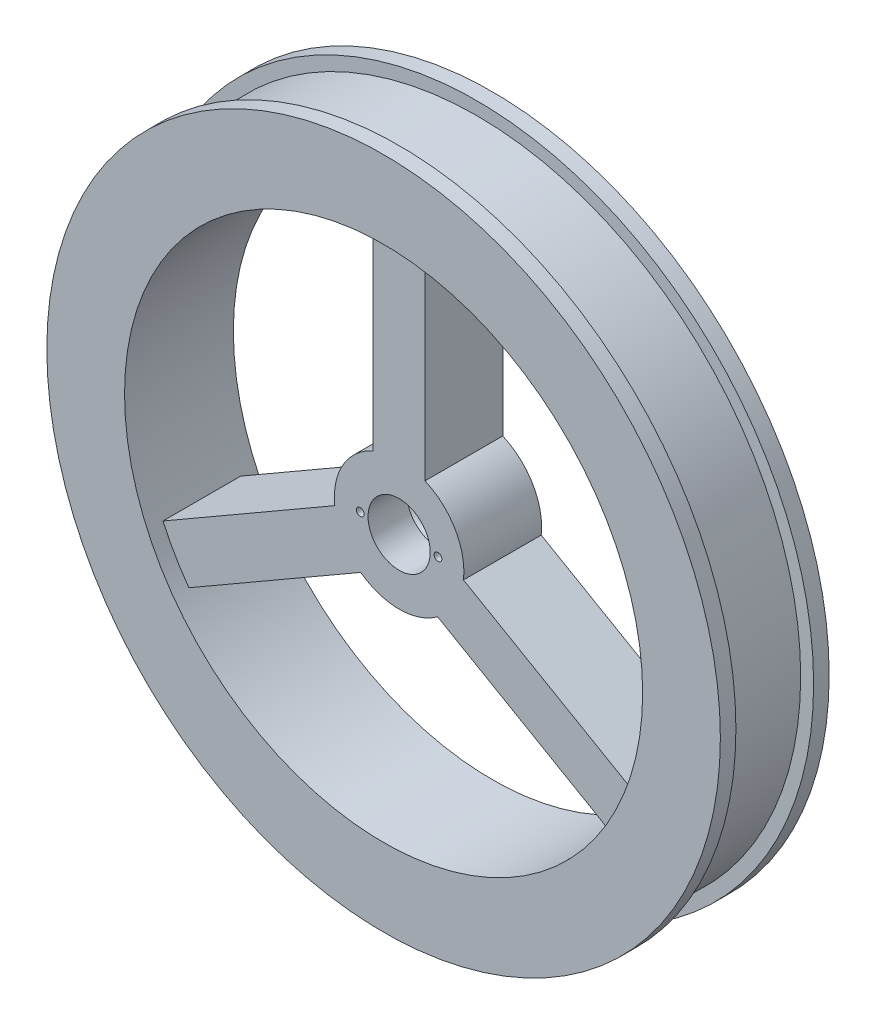
ISO-10303-21;
HEADER;
FILE_DESCRIPTION(('STEP AP214'),'2;1');
FILE_NAME('part.step','',(''),(''),'','','');
FILE_SCHEMA(('AUTOMOTIVE_DESIGN { 1 0 10303 214 1 1 1 1 }'));
ENDSEC;
DATA;
#1=APPLICATION_CONTEXT('core data for automotive mechanical design processes');
#2=APPLICATION_PROTOCOL_DEFINITION('international standard','automotive_design',2000,#1);
#3=PRODUCT_CONTEXT('',#1,'mechanical');
#4=PRODUCT('Part','Part','',(#3));
#5=PRODUCT_RELATED_PRODUCT_CATEGORY('part','',(#4));
#6=PRODUCT_DEFINITION_FORMATION('','',#4);
#7=PRODUCT_DEFINITION_CONTEXT('part definition',#1,'design');
#8=PRODUCT_DEFINITION('design','',#6,#7);
#9=PRODUCT_DEFINITION_SHAPE('','',#8);
#10=(LENGTH_UNIT() NAMED_UNIT(*) SI_UNIT(.MILLI.,.METRE.));
#11=(NAMED_UNIT(*) PLANE_ANGLE_UNIT() SI_UNIT($,.RADIAN.));
#12=(NAMED_UNIT(*) SI_UNIT($,.STERADIAN.) SOLID_ANGLE_UNIT());
#13=UNCERTAINTY_MEASURE_WITH_UNIT(LENGTH_MEASURE(1.E-05),#10,'distance_accuracy_value','');
#14=(GEOMETRIC_REPRESENTATION_CONTEXT(3) GLOBAL_UNCERTAINTY_ASSIGNED_CONTEXT((#13)) GLOBAL_UNIT_ASSIGNED_CONTEXT((#10,
#11,#12)) REPRESENTATION_CONTEXT('',''));
#15=CARTESIAN_POINT('',(0.,0.,0.));
#16=DIRECTION('',(0.,0.,1.));
#17=DIRECTION('',(1.,0.,0.));
#18=AXIS2_PLACEMENT_3D('',#15,#16,#17);
#19=CARTESIAN_POINT('',(0.,0.,150.));
#20=DIRECTION('',(0.,0.,-1.));
#21=DIRECTION('',(-1.,0.,0.));
#22=AXIS2_PLACEMENT_3D('',#19,#20,#21);
#23=CYLINDRICAL_SURFACE('',#22,60.);
#24=CARTESIAN_POINT('',(0.,0.,150.));
#25=DIRECTION('',(0.,0.,-1.));
#26=DIRECTION('',(-1.,0.,0.));
#27=AXIS2_PLACEMENT_3D('',#24,#25,#26);
#28=CIRCLE('',#27,60.);
#29=CARTESIAN_POINT('',(-60.,0.,150.));
#30=VERTEX_POINT('',#29);
#31=EDGE_CURVE('E275',#30,#30,#28,.T.);
#32=ORIENTED_EDGE('',*,*,#31,.F.);
#33=EDGE_LOOP('',(#32));
#34=FACE_BOUND('',#33,.T.);
#35=CARTESIAN_POINT('',(0.,0.,75.));
#36=DIRECTION('',(0.,0.,-1.));
#37=DIRECTION('',(-1.,0.,0.));
#38=AXIS2_PLACEMENT_3D('',#35,#36,#37);
#39=CIRCLE('',#38,60.);
#40=CARTESIAN_POINT('',(-60.,0.,75.));
#41=VERTEX_POINT('',#40);
#42=EDGE_CURVE('E188',#41,#41,#39,.F.);
#43=ORIENTED_EDGE('',*,*,#42,.F.);
#44=EDGE_LOOP('',(#43));
#45=FACE_BOUND('',#44,.T.);
#46=ADVANCED_FACE('F35',(#34,#45),#23,.F.);
#47=CARTESIAN_POINT('',(0.,0.,150.));
#48=DIRECTION('',(0.,0.,1.));
#49=DIRECTION('',(1.,0.,0.));
#50=AXIS2_PLACEMENT_3D('',#47,#48,#49);
#51=PLANE('',#50);
#52=CARTESIAN_POINT('',(0.,0.,150.));
#53=DIRECTION('',(0.,0.,-1.));
#54=DIRECTION('',(-1.,0.,0.));
#55=AXIS2_PLACEMENT_3D('',#52,#53,#54);
#56=CIRCLE('',#55,500.);
#57=CARTESIAN_POINT('',(-50.0000000000001,497.49371855331,150.));
#58=VERTEX_POINT('',#57);
#59=CARTESIAN_POINT('',(50.,497.49371855331,150.));
#60=VERTEX_POINT('',#59);
#61=EDGE_CURVE('E46',#58,#60,#56,.T.);
#62=ORIENTED_EDGE('',*,*,#61,.F.);
#63=DIRECTION('',(0.,1.,0.));
#64=VECTOR('',#63,1.);
#65=CARTESIAN_POINT('',(-50.0000000000001,497.49371855331,150.));
#66=LINE('',#65,#64);
#67=CARTESIAN_POINT('',(-50.,114.564392373896,150.));
#68=VERTEX_POINT('',#67);
#69=EDGE_CURVE('E130',#68,#58,#66,.T.);
#70=ORIENTED_EDGE('',*,*,#69,.F.);
#71=CARTESIAN_POINT('',(0.,0.,150.));
#72=DIRECTION('',(0.,0.,-1.));
#73=DIRECTION('',(1.,0.,0.));
#74=AXIS2_PLACEMENT_3D('',#71,#72,#73);
#75=CIRCLE('',#74,125.);
#76=CARTESIAN_POINT('',(-124.215674164922,-13.9809259977267,150.));
#77=VERTEX_POINT('',#76);
#78=EDGE_CURVE('E145',#77,#68,#75,.T.);
#79=ORIENTED_EDGE('',*,*,#78,.F.);
#80=DIRECTION('',(0.866025403784436,0.500000000000004,0.));
#81=VECTOR('',#80,1.);
#82=CARTESIAN_POINT('',(-124.215674164922,-13.9809259977267,150.));
#83=LINE('',#82,#81);
#84=CARTESIAN_POINT('',(-455.842198490351,-205.445589087435,150.));
#85=VERTEX_POINT('',#84);
#86=EDGE_CURVE('E304',#85,#77,#83,.T.);
#87=ORIENTED_EDGE('',*,*,#86,.F.);
#88=CARTESIAN_POINT('',(-405.842198490351,-292.048129465879,150.));
#89=VERTEX_POINT('',#88);
#90=EDGE_CURVE('E44',#89,#85,#56,.T.);
#91=ORIENTED_EDGE('',*,*,#90,.F.);
#92=DIRECTION('',(-0.866025403784436,-0.500000000000004,0.));
#93=VECTOR('',#92,1.);
#94=CARTESIAN_POINT('',(-74.2156741649217,-100.58346637617,150.));
#95=LINE('',#94,#93);
#96=CARTESIAN_POINT('',(-74.2156741649217,-100.58346637617,150.));
#97=VERTEX_POINT('',#96);
#98=EDGE_CURVE('E288',#97,#89,#95,.T.);
#99=ORIENTED_EDGE('',*,*,#98,.F.);
#100=CARTESIAN_POINT('',(0.,0.,150.));
#101=DIRECTION('',(0.,0.,-1.));
#102=DIRECTION('',(1.,0.,0.));
#103=AXIS2_PLACEMENT_3D('',#100,#101,#102);
#104=CIRCLE('',#103,125.);
#105=CARTESIAN_POINT('',(74.2156741649217,-100.58346637617,150.));
#106=VERTEX_POINT('',#105);
#107=EDGE_CURVE('E285',#106,#97,#104,.T.);
#108=ORIENTED_EDGE('',*,*,#107,.F.);
#109=DIRECTION('',(-0.866025403784436,0.500000000000004,0.));
#110=VECTOR('',#109,1.);
#111=CARTESIAN_POINT('',(74.2156741649217,-100.58346637617,150.));
#112=LINE('',#111,#110);
#113=CARTESIAN_POINT('',(405.842198490351,-292.048129465879,150.));
#114=VERTEX_POINT('',#113);
#115=EDGE_CURVE('E283',#114,#106,#112,.T.);
#116=ORIENTED_EDGE('',*,*,#115,.F.);
#117=CARTESIAN_POINT('',(455.842198490351,-205.445589087435,150.));
#118=VERTEX_POINT('',#117);
#119=EDGE_CURVE('E11',#118,#114,#56,.T.);
#120=ORIENTED_EDGE('',*,*,#119,.F.);
#121=DIRECTION('',(0.866025403784436,-0.500000000000004,0.));
#122=VECTOR('',#121,1.);
#123=CARTESIAN_POINT('',(124.215674164922,-13.9809259977266,150.));
#124=LINE('',#123,#122);
#125=CARTESIAN_POINT('',(124.215674164922,-13.9809259977266,150.));
#126=VERTEX_POINT('',#125);
#127=EDGE_CURVE('E167',#126,#118,#124,.T.);
#128=ORIENTED_EDGE('',*,*,#127,.F.);
#129=CARTESIAN_POINT('',(0.,0.,150.));
#130=DIRECTION('',(0.,0.,-1.));
#131=DIRECTION('',(1.,0.,0.));
#132=AXIS2_PLACEMENT_3D('',#129,#130,#131);
#133=CIRCLE('',#132,125.);
#134=CARTESIAN_POINT('',(50.,114.564392373896,150.));
#135=VERTEX_POINT('',#134);
#136=EDGE_CURVE('E163',#135,#126,#133,.T.);
#137=ORIENTED_EDGE('',*,*,#136,.F.);
#138=DIRECTION('',(0.,-1.,0.));
#139=VECTOR('',#138,1.);
#140=CARTESIAN_POINT('',(50.,497.49371855331,150.));
#141=LINE('',#140,#139);
#142=EDGE_CURVE('E132',#60,#135,#141,.T.);
#143=ORIENTED_EDGE('',*,*,#142,.F.);
#144=EDGE_LOOP('',(#62,#70,#79,#87,#91,#99,#108,#116,#120,#128,#137,#143));
#145=FACE_BOUND('',#144,.T.);
#146=CARTESIAN_POINT('',(75.,0.,150.));
#147=DIRECTION('',(0.,0.,-1.));
#148=DIRECTION('',(-1.,0.,0.));
#149=AXIS2_PLACEMENT_3D('',#146,#147,#148);
#150=CIRCLE('',#149,7.50000000000001);
#151=CARTESIAN_POINT('',(67.5,0.,150.));
#152=VERTEX_POINT('',#151);
#153=EDGE_CURVE('E331',#152,#152,#150,.T.);
#154=ORIENTED_EDGE('',*,*,#153,.T.);
#155=EDGE_LOOP('',(#154));
#156=FACE_BOUND('',#155,.T.);
#157=CARTESIAN_POINT('',(-75.,0.,150.));
#158=DIRECTION('',(0.,0.,-1.));
#159=DIRECTION('',(-1.,0.,0.));
#160=AXIS2_PLACEMENT_3D('',#157,#158,#159);
#161=CIRCLE('',#160,7.50000000000001);
#162=CARTESIAN_POINT('',(-82.5,0.,150.));
#163=VERTEX_POINT('',#162);
#164=EDGE_CURVE('E191',#163,#163,#161,.T.);
#165=ORIENTED_EDGE('',*,*,#164,.T.);
#166=EDGE_LOOP('',(#165));
#167=FACE_BOUND('',#166,.T.);
#168=ORIENTED_EDGE('',*,*,#31,.T.);
#169=EDGE_LOOP('',(#168));
#170=FACE_BOUND('',#169,.T.);
#171=ADVANCED_FACE('F127',(#145,#156,#167,#170),#51,.T.);
#172=CARTESIAN_POINT('',(0.,0.,0.));
#173=DIRECTION('',(0.,0.,1.));
#174=DIRECTION('',(1.,0.,0.));
#175=AXIS2_PLACEMENT_3D('',#172,#173,#174);
#176=PLANE('',#175);
#177=CARTESIAN_POINT('',(75.,0.,0.));
#178=DIRECTION('',(0.,0.,-1.));
#179=DIRECTION('',(-1.,0.,0.));
#180=AXIS2_PLACEMENT_3D('',#177,#178,#179);
#181=CIRCLE('',#180,7.50000000000001);
#182=CARTESIAN_POINT('',(67.5,0.,0.));
#183=VERTEX_POINT('',#182);
#184=EDGE_CURVE('E320',#183,#183,#181,.T.);
#185=ORIENTED_EDGE('',*,*,#184,.F.);
#186=EDGE_LOOP('',(#185));
#187=FACE_BOUND('',#186,.T.);
#188=CARTESIAN_POINT('',(-75.,0.,0.));
#189=DIRECTION('',(0.,0.,-1.));
#190=DIRECTION('',(-1.,0.,0.));
#191=AXIS2_PLACEMENT_3D('',#188,#189,#190);
#192=CIRCLE('',#191,7.50000000000001);
#193=CARTESIAN_POINT('',(-82.5,0.,0.));
#194=VERTEX_POINT('',#193);
#195=EDGE_CURVE('E323',#194,#194,#192,.T.);
#196=ORIENTED_EDGE('',*,*,#195,.F.);
#197=EDGE_LOOP('',(#196));
#198=FACE_BOUND('',#197,.T.);
#199=CARTESIAN_POINT('',(0.,0.,0.));
#200=DIRECTION('',(0.,0.,-1.));
#201=DIRECTION('',(-1.,0.,0.));
#202=AXIS2_PLACEMENT_3D('',#199,#200,#201);
#203=CIRCLE('',#202,60.);
#204=CARTESIAN_POINT('',(-60.,0.,0.));
#205=VERTEX_POINT('',#204);
#206=EDGE_CURVE('E273',#205,#205,#203,.T.);
#207=ORIENTED_EDGE('',*,*,#206,.F.);
#208=EDGE_LOOP('',(#207));
#209=FACE_BOUND('',#208,.T.);
#210=DIRECTION('',(0.,1.,0.));
#211=VECTOR('',#210,1.);
#212=CARTESIAN_POINT('',(-50.0000000000001,497.49371855331,0.));
#213=LINE('',#212,#211);
#214=CARTESIAN_POINT('',(-50.,114.564392373896,0.));
#215=VERTEX_POINT('',#214);
#216=CARTESIAN_POINT('',(-50.0000000000001,497.49371855331,0.));
#217=VERTEX_POINT('',#216);
#218=EDGE_CURVE('E155',#215,#217,#213,.T.);
#219=ORIENTED_EDGE('',*,*,#218,.T.);
#220=CARTESIAN_POINT('',(0.,0.,0.));
#221=DIRECTION('',(0.,0.,-1.));
#222=DIRECTION('',(-1.,0.,0.));
#223=AXIS2_PLACEMENT_3D('',#220,#221,#222);
#224=CIRCLE('',#223,500.);
#225=CARTESIAN_POINT('',(50.,497.49371855331,0.));
#226=VERTEX_POINT('',#225);
#227=EDGE_CURVE('E150',#217,#226,#224,.T.);
#228=ORIENTED_EDGE('',*,*,#227,.T.);
#229=DIRECTION('',(0.,-1.,0.));
#230=VECTOR('',#229,1.);
#231=CARTESIAN_POINT('',(50.,497.49371855331,0.));
#232=LINE('',#231,#230);
#233=CARTESIAN_POINT('',(50.,114.564392373896,0.));
#234=VERTEX_POINT('',#233);
#235=EDGE_CURVE('E161',#226,#234,#232,.T.);
#236=ORIENTED_EDGE('',*,*,#235,.T.);
#237=CARTESIAN_POINT('',(0.,0.,0.));
#238=DIRECTION('',(0.,0.,-1.));
#239=DIRECTION('',(1.,0.,0.));
#240=AXIS2_PLACEMENT_3D('',#237,#238,#239);
#241=CIRCLE('',#240,125.);
#242=CARTESIAN_POINT('',(124.215674164922,-13.9809259977266,0.));
#243=VERTEX_POINT('',#242);
#244=EDGE_CURVE('E173',#234,#243,#241,.T.);
#245=ORIENTED_EDGE('',*,*,#244,.T.);
#246=DIRECTION('',(0.866025403784436,-0.500000000000004,0.));
#247=VECTOR('',#246,1.);
#248=CARTESIAN_POINT('',(124.215674164922,-13.9809259977266,0.));
#249=LINE('',#248,#247);
#250=CARTESIAN_POINT('',(455.842198490351,-205.445589087435,0.));
#251=VERTEX_POINT('',#250);
#252=EDGE_CURVE('E164',#243,#251,#249,.T.);
#253=ORIENTED_EDGE('',*,*,#252,.T.);
#254=CARTESIAN_POINT('',(405.842198490351,-292.048129465879,0.));
#255=VERTEX_POINT('',#254);
#256=EDGE_CURVE('E201',#251,#255,#224,.T.);
#257=ORIENTED_EDGE('',*,*,#256,.T.);
#258=DIRECTION('',(-0.866025403784436,0.500000000000004,0.));
#259=VECTOR('',#258,1.);
#260=CARTESIAN_POINT('',(74.2156741649217,-100.58346637617,0.));
#261=LINE('',#260,#259);
#262=CARTESIAN_POINT('',(74.2156741649217,-100.58346637617,0.));
#263=VERTEX_POINT('',#262);
#264=EDGE_CURVE('E278',#255,#263,#261,.T.);
#265=ORIENTED_EDGE('',*,*,#264,.T.);
#266=CARTESIAN_POINT('',(0.,0.,0.));
#267=DIRECTION('',(0.,0.,-1.));
#268=DIRECTION('',(1.,0.,0.));
#269=AXIS2_PLACEMENT_3D('',#266,#267,#268);
#270=CIRCLE('',#269,125.);
#271=CARTESIAN_POINT('',(-74.2156741649217,-100.58346637617,0.));
#272=VERTEX_POINT('',#271);
#273=EDGE_CURVE('E292',#263,#272,#270,.T.);
#274=ORIENTED_EDGE('',*,*,#273,.T.);
#275=DIRECTION('',(-0.866025403784436,-0.500000000000004,0.));
#276=VECTOR('',#275,1.);
#277=CARTESIAN_POINT('',(-74.2156741649217,-100.58346637617,0.));
#278=LINE('',#277,#276);
#279=CARTESIAN_POINT('',(-405.842198490351,-292.048129465879,0.));
#280=VERTEX_POINT('',#279);
#281=EDGE_CURVE('E286',#272,#280,#278,.T.);
#282=ORIENTED_EDGE('',*,*,#281,.T.);
#283=CARTESIAN_POINT('',(-455.842198490351,-205.445589087435,0.));
#284=VERTEX_POINT('',#283);
#285=EDGE_CURVE('E197',#280,#284,#224,.T.);
#286=ORIENTED_EDGE('',*,*,#285,.T.);
#287=DIRECTION('',(0.866025403784436,0.500000000000004,0.));
#288=VECTOR('',#287,1.);
#289=CARTESIAN_POINT('',(-124.215674164922,-13.9809259977267,0.));
#290=LINE('',#289,#288);
#291=CARTESIAN_POINT('',(-124.215674164922,-13.9809259977267,0.));
#292=VERTEX_POINT('',#291);
#293=EDGE_CURVE('E303',#284,#292,#290,.T.);
#294=ORIENTED_EDGE('',*,*,#293,.T.);
#295=CARTESIAN_POINT('',(0.,0.,0.));
#296=DIRECTION('',(0.,0.,-1.));
#297=DIRECTION('',(1.,0.,0.));
#298=AXIS2_PLACEMENT_3D('',#295,#296,#297);
#299=CIRCLE('',#298,125.);
#300=EDGE_CURVE('E307',#292,#215,#299,.T.);
#301=ORIENTED_EDGE('',*,*,#300,.T.);
#302=EDGE_LOOP('',(#219,#228,#236,#245,#253,#257,#265,#274,#282,#286,#294,#301));
#303=FACE_BOUND('',#302,.T.);
#304=ADVANCED_FACE('F240',(#187,#198,#209,#303),#176,.F.);
#305=CARTESIAN_POINT('',(0.,0.,150.));
#306=DIRECTION('',(0.,0.,-1.));
#307=DIRECTION('',(-1.,0.,0.));
#308=AXIS2_PLACEMENT_3D('',#305,#306,#307);
#309=CYLINDRICAL_SURFACE('',#308,625.);
#310=CARTESIAN_POINT('',(0.,0.,150.));
#311=DIRECTION('',(0.,0.,1.));
#312=DIRECTION('',(1.,0.,0.));
#313=AXIS2_PLACEMENT_3D('',#310,#311,#312);
#314=CIRCLE('',#313,625.);
#315=CARTESIAN_POINT('',(625.,0.,150.));
#316=VERTEX_POINT('',#315);
#317=EDGE_CURVE('E185',#316,#316,#314,.T.);
#318=ORIENTED_EDGE('',*,*,#317,.F.);
#319=EDGE_LOOP('',(#318));
#320=FACE_BOUND('',#319,.T.);
#321=CARTESIAN_POINT('',(0.,0.,0.));
#322=DIRECTION('',(0.,0.,1.));
#323=DIRECTION('',(1.,0.,0.));
#324=AXIS2_PLACEMENT_3D('',#321,#322,#323);
#325=CIRCLE('',#324,625.);
#326=CARTESIAN_POINT('',(625.,0.,0.));
#327=VERTEX_POINT('',#326);
#328=EDGE_CURVE('E189',#327,#327,#325,.T.);
#329=ORIENTED_EDGE('',*,*,#328,.T.);
#330=EDGE_LOOP('',(#329));
#331=FACE_BOUND('',#330,.T.);
#332=ADVANCED_FACE('F229',(#320,#331),#309,.T.);
#333=CARTESIAN_POINT('',(0.,0.,150.));
#334=DIRECTION('',(0.,0.,-1.));
#335=DIRECTION('',(-1.,0.,0.));
#336=AXIS2_PLACEMENT_3D('',#333,#334,#335);
#337=CYLINDRICAL_SURFACE('',#336,500.);
#338=ORIENTED_EDGE('',*,*,#61,.T.);
#339=DIRECTION('',(0.,0.,-1.));
#340=VECTOR('',#339,1.);
#341=CARTESIAN_POINT('',(50.,497.49371855331,150.));
#342=LINE('',#341,#340);
#343=EDGE_CURVE('E183',#60,#226,#342,.T.);
#344=ORIENTED_EDGE('',*,*,#343,.T.);
#345=ORIENTED_EDGE('',*,*,#227,.F.);
#346=DIRECTION('',(0.,0.,-1.));
#347=VECTOR('',#346,1.);
#348=CARTESIAN_POINT('',(-50.0000000000001,497.49371855331,150.));
#349=LINE('',#348,#347);
#350=EDGE_CURVE('E141',#58,#217,#349,.T.);
#351=ORIENTED_EDGE('',*,*,#350,.F.);
#352=EDGE_LOOP('',(#338,#344,#345,#351));
#353=FACE_BOUND('',#352,.T.);
#354=ORIENTED_EDGE('',*,*,#119,.T.);
#355=DIRECTION('',(0.,0.,-1.));
#356=VECTOR('',#355,1.);
#357=CARTESIAN_POINT('',(405.842198490351,-292.048129465879,150.));
#358=LINE('',#357,#356);
#359=EDGE_CURVE('E300',#114,#255,#358,.T.);
#360=ORIENTED_EDGE('',*,*,#359,.T.);
#361=ORIENTED_EDGE('',*,*,#256,.F.);
#362=DIRECTION('',(0.,0.,-1.));
#363=VECTOR('',#362,1.);
#364=CARTESIAN_POINT('',(455.842198490351,-205.445589087435,150.));
#365=LINE('',#364,#363);
#366=EDGE_CURVE('E170',#118,#251,#365,.T.);
#367=ORIENTED_EDGE('',*,*,#366,.F.);
#368=EDGE_LOOP('',(#354,#360,#361,#367));
#369=FACE_BOUND('',#368,.T.);
#370=DIRECTION('',(0.,0.,-1.));
#371=VECTOR('',#370,1.);
#372=CARTESIAN_POINT('',(-405.842198490351,-292.048129465879,150.));
#373=LINE('',#372,#371);
#374=EDGE_CURVE('E58',#89,#280,#373,.T.);
#375=ORIENTED_EDGE('',*,*,#374,.F.);
#376=ORIENTED_EDGE('',*,*,#90,.T.);
#377=DIRECTION('',(0.,0.,-1.));
#378=VECTOR('',#377,1.);
#379=CARTESIAN_POINT('',(-455.842198490351,-205.445589087435,150.));
#380=LINE('',#379,#378);
#381=EDGE_CURVE('E159',#85,#284,#380,.T.);
#382=ORIENTED_EDGE('',*,*,#381,.T.);
#383=ORIENTED_EDGE('',*,*,#285,.F.);
#384=EDGE_LOOP('',(#375,#376,#382,#383));
#385=FACE_BOUND('',#384,.T.);
#386=CARTESIAN_POINT('',(0.,0.,-30.));
#387=DIRECTION('',(0.,0.,-1.));
#388=DIRECTION('',(-1.,0.,0.));
#389=AXIS2_PLACEMENT_3D('',#386,#387,#388);
#390=CIRCLE('',#389,500.);
#391=CARTESIAN_POINT('',(-500.,0.,-30.));
#392=VERTEX_POINT('',#391);
#393=EDGE_CURVE('E208',#392,#392,#390,.T.);
#394=ORIENTED_EDGE('',*,*,#393,.T.);
#395=EDGE_LOOP('',(#394));
#396=FACE_BOUND('',#395,.T.);
#397=CARTESIAN_POINT('',(0.,0.,180.));
#398=DIRECTION('',(0.,0.,-1.));
#399=DIRECTION('',(-1.,0.,0.));
#400=AXIS2_PLACEMENT_3D('',#397,#398,#399);
#401=CIRCLE('',#400,500.);
#402=CARTESIAN_POINT('',(-500.,0.,180.));
#403=VERTEX_POINT('',#402);
#404=EDGE_CURVE('E137',#403,#403,#401,.T.);
#405=ORIENTED_EDGE('',*,*,#404,.F.);
#406=EDGE_LOOP('',(#405));
#407=FACE_BOUND('',#406,.T.);
#408=ADVANCED_FACE('F148',(#353,#369,#385,#396,#407),#337,.F.);
#409=CARTESIAN_POINT('',(50.,497.49371855331,150.));
#410=DIRECTION('',(1.,0.,0.));
#411=DIRECTION('',(0.,1.,0.));
#412=AXIS2_PLACEMENT_3D('',#409,#410,#411);
#413=PLANE('',#412);
#414=ORIENTED_EDGE('',*,*,#235,.F.);
#415=ORIENTED_EDGE('',*,*,#343,.F.);
#416=ORIENTED_EDGE('',*,*,#142,.T.);
#417=DIRECTION('',(0.,0.,-1.));
#418=VECTOR('',#417,1.);
#419=CARTESIAN_POINT('',(50.,114.564392373896,150.));
#420=LINE('',#419,#418);
#421=EDGE_CURVE('E181',#135,#234,#420,.T.);
#422=ORIENTED_EDGE('',*,*,#421,.T.);
#423=EDGE_LOOP('',(#414,#415,#416,#422));
#424=FACE_BOUND('',#423,.T.);
#425=ADVANCED_FACE('F228',(#424),#413,.T.);
#426=CARTESIAN_POINT('',(0.,0.,150.));
#427=DIRECTION('',(0.,0.,-1.));
#428=DIRECTION('',(-1.,0.,0.));
#429=AXIS2_PLACEMENT_3D('',#426,#427,#428);
#430=CYLINDRICAL_SURFACE('',#429,125.);
#431=ORIENTED_EDGE('',*,*,#244,.F.);
#432=ORIENTED_EDGE('',*,*,#421,.F.);
#433=ORIENTED_EDGE('',*,*,#136,.T.);
#434=DIRECTION('',(0.,0.,-1.));
#435=VECTOR('',#434,1.);
#436=CARTESIAN_POINT('',(124.215674164922,-13.9809259977266,150.));
#437=LINE('',#436,#435);
#438=EDGE_CURVE('E179',#126,#243,#437,.T.);
#439=ORIENTED_EDGE('',*,*,#438,.T.);
#440=EDGE_LOOP('',(#431,#432,#433,#439));
#441=FACE_BOUND('',#440,.T.);
#442=ADVANCED_FACE('F236',(#441),#430,.T.);
#443=CARTESIAN_POINT('',(124.215674164922,-13.9809259977266,150.));
#444=DIRECTION('',(0.500000000000004,0.866025403784436,0.));
#445=DIRECTION('',(-0.866025403784436,0.500000000000004,0.));
#446=AXIS2_PLACEMENT_3D('',#443,#444,#445);
#447=PLANE('',#446);
#448=ORIENTED_EDGE('',*,*,#252,.F.);
#449=ORIENTED_EDGE('',*,*,#438,.F.);
#450=ORIENTED_EDGE('',*,*,#127,.T.);
#451=ORIENTED_EDGE('',*,*,#366,.T.);
#452=EDGE_LOOP('',(#448,#449,#450,#451));
#453=FACE_BOUND('',#452,.T.);
#454=ADVANCED_FACE('F491',(#453),#447,.T.);
#455=CARTESIAN_POINT('',(-124.215674164922,-13.9809259977267,150.));
#456=DIRECTION('',(-0.500000000000004,0.866025403784436,0.));
#457=DIRECTION('',(-0.866025403784436,-0.500000000000004,0.));
#458=AXIS2_PLACEMENT_3D('',#455,#456,#457);
#459=PLANE('',#458);
#460=ORIENTED_EDGE('',*,*,#293,.F.);
#461=ORIENTED_EDGE('',*,*,#381,.F.);
#462=ORIENTED_EDGE('',*,*,#86,.T.);
#463=DIRECTION('',(0.,0.,-1.));
#464=VECTOR('',#463,1.);
#465=CARTESIAN_POINT('',(-124.215674164922,-13.9809259977267,150.));
#466=LINE('',#465,#464);
#467=EDGE_CURVE('E152',#77,#292,#466,.T.);
#468=ORIENTED_EDGE('',*,*,#467,.T.);
#469=EDGE_LOOP('',(#460,#461,#462,#468));
#470=FACE_BOUND('',#469,.T.);
#471=ADVANCED_FACE('F495',(#470),#459,.T.);
#472=CARTESIAN_POINT('',(0.,0.,150.));
#473=DIRECTION('',(0.,0.,-1.));
#474=DIRECTION('',(-1.,0.,0.));
#475=AXIS2_PLACEMENT_3D('',#472,#473,#474);
#476=CYLINDRICAL_SURFACE('',#475,125.);
#477=ORIENTED_EDGE('',*,*,#300,.F.);
#478=ORIENTED_EDGE('',*,*,#467,.F.);
#479=ORIENTED_EDGE('',*,*,#78,.T.);
#480=DIRECTION('',(0.,0.,-1.));
#481=VECTOR('',#480,1.);
#482=CARTESIAN_POINT('',(-50.,114.564392373896,150.));
#483=LINE('',#482,#481);
#484=EDGE_CURVE('E143',#68,#215,#483,.T.);
#485=ORIENTED_EDGE('',*,*,#484,.T.);
#486=EDGE_LOOP('',(#477,#478,#479,#485));
#487=FACE_BOUND('',#486,.T.);
#488=ADVANCED_FACE('F503',(#487),#476,.T.);
#489=CARTESIAN_POINT('',(-50.0000000000001,497.49371855331,150.));
#490=DIRECTION('',(-1.,0.,0.));
#491=DIRECTION('',(0.,-1.,0.));
#492=AXIS2_PLACEMENT_3D('',#489,#490,#491);
#493=PLANE('',#492);
#494=ORIENTED_EDGE('',*,*,#218,.F.);
#495=ORIENTED_EDGE('',*,*,#484,.F.);
#496=ORIENTED_EDGE('',*,*,#69,.T.);
#497=ORIENTED_EDGE('',*,*,#350,.T.);
#498=EDGE_LOOP('',(#494,#495,#496,#497));
#499=FACE_BOUND('',#498,.T.);
#500=ADVANCED_FACE('F140',(#499),#493,.T.);
#501=CARTESIAN_POINT('',(74.2156741649217,-100.58346637617,150.));
#502=DIRECTION('',(-0.500000000000004,-0.866025403784436,0.));
#503=DIRECTION('',(0.866025403784436,-0.500000000000004,0.));
#504=AXIS2_PLACEMENT_3D('',#501,#502,#503);
#505=PLANE('',#504);
#506=ORIENTED_EDGE('',*,*,#264,.F.);
#507=ORIENTED_EDGE('',*,*,#359,.F.);
#508=ORIENTED_EDGE('',*,*,#115,.T.);
#509=DIRECTION('',(0.,0.,-1.));
#510=VECTOR('',#509,1.);
#511=CARTESIAN_POINT('',(74.2156741649217,-100.58346637617,150.));
#512=LINE('',#511,#510);
#513=EDGE_CURVE('E298',#106,#263,#512,.T.);
#514=ORIENTED_EDGE('',*,*,#513,.T.);
#515=EDGE_LOOP('',(#506,#507,#508,#514));
#516=FACE_BOUND('',#515,.T.);
#517=ADVANCED_FACE('F512',(#516),#505,.T.);
#518=CARTESIAN_POINT('',(0.,0.,150.));
#519=DIRECTION('',(0.,0.,-1.));
#520=DIRECTION('',(-1.,0.,0.));
#521=AXIS2_PLACEMENT_3D('',#518,#519,#520);
#522=CYLINDRICAL_SURFACE('',#521,125.);
#523=ORIENTED_EDGE('',*,*,#273,.F.);
#524=ORIENTED_EDGE('',*,*,#513,.F.);
#525=ORIENTED_EDGE('',*,*,#107,.T.);
#526=DIRECTION('',(0.,0.,-1.));
#527=VECTOR('',#526,1.);
#528=CARTESIAN_POINT('',(-74.2156741649217,-100.58346637617,150.));
#529=LINE('',#528,#527);
#530=EDGE_CURVE('E53',#97,#272,#529,.T.);
#531=ORIENTED_EDGE('',*,*,#530,.T.);
#532=EDGE_LOOP('',(#523,#524,#525,#531));
#533=FACE_BOUND('',#532,.T.);
#534=ADVANCED_FACE('F266',(#533),#522,.T.);
#535=CARTESIAN_POINT('',(-74.2156741649217,-100.58346637617,150.));
#536=DIRECTION('',(0.500000000000004,-0.866025403784436,0.));
#537=DIRECTION('',(0.866025403784436,0.500000000000004,0.));
#538=AXIS2_PLACEMENT_3D('',#535,#536,#537);
#539=PLANE('',#538);
#540=ORIENTED_EDGE('',*,*,#281,.F.);
#541=ORIENTED_EDGE('',*,*,#530,.F.);
#542=ORIENTED_EDGE('',*,*,#98,.T.);
#543=ORIENTED_EDGE('',*,*,#374,.T.);
#544=EDGE_LOOP('',(#540,#541,#542,#543));
#545=FACE_BOUND('',#544,.T.);
#546=ADVANCED_FACE('F257',(#545),#539,.T.);
#547=CARTESIAN_POINT('',(0.,0.,42.5));
#548=DIRECTION('',(0.,0.,-1.));
#549=DIRECTION('',(-1.,0.,0.));
#550=AXIS2_PLACEMENT_3D('',#547,#548,#549);
#551=CIRCLE('',#550,60.);
#552=CARTESIAN_POINT('',(-60.,0.,42.5));
#553=VERTEX_POINT('',#552);
#554=EDGE_CURVE('E270',#553,#553,#551,.T.);
#555=ORIENTED_EDGE('',*,*,#554,.F.);
#556=EDGE_LOOP('',(#555));
#557=FACE_BOUND('',#556,.T.);
#558=ORIENTED_EDGE('',*,*,#206,.T.);
#559=EDGE_LOOP('',(#558));
#560=FACE_BOUND('',#559,.T.);
#561=ADVANCED_FACE('F246',(#557,#560),#23,.F.);
#562=CARTESIAN_POINT('',(0.,0.,42.5));
#563=DIRECTION('',(0.,0.,-1.));
#564=DIRECTION('',(-1.,0.,0.));
#565=AXIS2_PLACEMENT_3D('',#562,#563,#564);
#566=PLANE('',#565);
#567=ORIENTED_EDGE('',*,*,#554,.T.);
#568=EDGE_LOOP('',(#567));
#569=FACE_BOUND('',#568,.T.);
#570=CARTESIAN_POINT('',(0.,0.,42.5));
#571=DIRECTION('',(0.,0.,-1.));
#572=DIRECTION('',(-1.,0.,0.));
#573=AXIS2_PLACEMENT_3D('',#570,#571,#572);
#574=CIRCLE('',#573,55.);
#575=CARTESIAN_POINT('',(-55.,0.,42.5));
#576=VERTEX_POINT('',#575);
#577=EDGE_CURVE('E280',#576,#576,#574,.T.);
#578=ORIENTED_EDGE('',*,*,#577,.F.);
#579=EDGE_LOOP('',(#578));
#580=FACE_BOUND('',#579,.T.);
#581=ADVANCED_FACE('F256',(#569,#580),#566,.T.);
#582=CARTESIAN_POINT('',(0.,0.,42.5));
#583=DIRECTION('',(0.,0.,1.));
#584=DIRECTION('',(1.,0.,0.));
#585=AXIS2_PLACEMENT_3D('',#582,#583,#584);
#586=CYLINDRICAL_SURFACE('',#585,55.);
#587=CARTESIAN_POINT('',(0.,0.,66.3397459621556));
#588=DIRECTION('',(0.,0.,1.));
#589=DIRECTION('',(1.,0.,0.));
#590=AXIS2_PLACEMENT_3D('',#587,#588,#589);
#591=CIRCLE('',#590,55.);
#592=CARTESIAN_POINT('',(55.,0.,66.3397459621556));
#593=VERTEX_POINT('',#592);
#594=EDGE_CURVE('E39',#593,#593,#591,.T.);
#595=ORIENTED_EDGE('',*,*,#594,.T.);
#596=EDGE_LOOP('',(#595));
#597=FACE_BOUND('',#596,.T.);
#598=ORIENTED_EDGE('',*,*,#577,.T.);
#599=EDGE_LOOP('',(#598));
#600=FACE_BOUND('',#599,.T.);
#601=ADVANCED_FACE('F263',(#597,#600),#586,.F.);
#602=CARTESIAN_POINT('',(0.,0.,66.3397459621556));
#603=DIRECTION('',(0.,0.,1.));
#604=DIRECTION('',(1.,0.,0.));
#605=AXIS2_PLACEMENT_3D('',#602,#603,#604);
#606=TOROIDAL_SURFACE('',#605,65.,10.);
#607=ORIENTED_EDGE('',*,*,#594,.F.);
#608=EDGE_LOOP('',(#607));
#609=FACE_BOUND('',#608,.T.);
#610=ORIENTED_EDGE('',*,*,#42,.T.);
#611=EDGE_LOOP('',(#610));
#612=FACE_BOUND('',#611,.T.);
#613=ADVANCED_FACE('F37',(#609,#612),#606,.T.);
#614=CARTESIAN_POINT('',(-75.,0.,30.));
#615=DIRECTION('',(0.,0.,-1.));
#616=DIRECTION('',(-1.,0.,0.));
#617=AXIS2_PLACEMENT_3D('',#614,#615,#616);
#618=CYLINDRICAL_SURFACE('',#617,7.50000000000001);
#619=CARTESIAN_POINT('',(-75.,0.,30.));
#620=DIRECTION('',(0.,0.,-1.));
#621=DIRECTION('',(-1.,0.,0.));
#622=AXIS2_PLACEMENT_3D('',#619,#620,#621);
#623=CIRCLE('',#622,7.50000000000001);
#624=CARTESIAN_POINT('',(-82.5,0.,30.));
#625=VERTEX_POINT('',#624);
#626=EDGE_CURVE('E325',#625,#625,#623,.T.);
#627=ORIENTED_EDGE('',*,*,#626,.F.);
#628=EDGE_LOOP('',(#627));
#629=FACE_BOUND('',#628,.T.);
#630=ORIENTED_EDGE('',*,*,#195,.T.);
#631=EDGE_LOOP('',(#630));
#632=FACE_BOUND('',#631,.T.);
#633=ADVANCED_FACE('F400',(#629,#632),#618,.F.);
#634=CARTESIAN_POINT('',(-75.,0.,30.));
#635=DIRECTION('',(0.,0.,-1.));
#636=DIRECTION('',(-1.,0.,0.));
#637=AXIS2_PLACEMENT_3D('',#634,#635,#636);
#638=PLANE('',#637);
#639=ORIENTED_EDGE('',*,*,#626,.T.);
#640=EDGE_LOOP('',(#639));
#641=FACE_BOUND('',#640,.T.);
#642=ADVANCED_FACE('F396',(#641),#638,.T.);
#643=CARTESIAN_POINT('',(75.,0.,30.));
#644=DIRECTION('',(0.,0.,-1.));
#645=DIRECTION('',(-1.,0.,0.));
#646=AXIS2_PLACEMENT_3D('',#643,#644,#645);
#647=CYLINDRICAL_SURFACE('',#646,7.50000000000001);
#648=CARTESIAN_POINT('',(75.,0.,30.));
#649=DIRECTION('',(0.,0.,-1.));
#650=DIRECTION('',(-1.,0.,0.));
#651=AXIS2_PLACEMENT_3D('',#648,#649,#650);
#652=CIRCLE('',#651,7.50000000000001);
#653=CARTESIAN_POINT('',(67.5,0.,30.));
#654=VERTEX_POINT('',#653);
#655=EDGE_CURVE('E336',#654,#654,#652,.T.);
#656=ORIENTED_EDGE('',*,*,#655,.F.);
#657=EDGE_LOOP('',(#656));
#658=FACE_BOUND('',#657,.T.);
#659=ORIENTED_EDGE('',*,*,#184,.T.);
#660=EDGE_LOOP('',(#659));
#661=FACE_BOUND('',#660,.T.);
#662=ADVANCED_FACE('F393',(#658,#661),#647,.F.);
#663=CARTESIAN_POINT('',(75.,0.,30.));
#664=DIRECTION('',(0.,0.,-1.));
#665=DIRECTION('',(-1.,0.,0.));
#666=AXIS2_PLACEMENT_3D('',#663,#664,#665);
#667=PLANE('',#666);
#668=ORIENTED_EDGE('',*,*,#655,.T.);
#669=EDGE_LOOP('',(#668));
#670=FACE_BOUND('',#669,.T.);
#671=ADVANCED_FACE('F389',(#670),#667,.T.);
#672=CARTESIAN_POINT('',(-75.,0.,120.));
#673=DIRECTION('',(0.,0.,1.));
#674=DIRECTION('',(1.,0.,0.));
#675=AXIS2_PLACEMENT_3D('',#672,#673,#674);
#676=CYLINDRICAL_SURFACE('',#675,7.50000000000001);
#677=CARTESIAN_POINT('',(-75.,0.,120.));
#678=DIRECTION('',(0.,0.,-1.));
#679=DIRECTION('',(-1.,0.,0.));
#680=AXIS2_PLACEMENT_3D('',#677,#678,#679);
#681=CIRCLE('',#680,7.50000000000001);
#682=CARTESIAN_POINT('',(-82.5,0.,120.));
#683=VERTEX_POINT('',#682);
#684=EDGE_CURVE('E346',#683,#683,#681,.T.);
#685=ORIENTED_EDGE('',*,*,#684,.T.);
#686=EDGE_LOOP('',(#685));
#687=FACE_BOUND('',#686,.T.);
#688=ORIENTED_EDGE('',*,*,#164,.F.);
#689=EDGE_LOOP('',(#688));
#690=FACE_BOUND('',#689,.T.);
#691=ADVANCED_FACE('F385',(#687,#690),#676,.F.);
#692=CARTESIAN_POINT('',(-75.,0.,120.));
#693=DIRECTION('',(0.,0.,1.));
#694=DIRECTION('',(-1.,0.,0.));
#695=AXIS2_PLACEMENT_3D('',#692,#693,#694);
#696=PLANE('',#695);
#697=ORIENTED_EDGE('',*,*,#684,.F.);
#698=EDGE_LOOP('',(#697));
#699=FACE_BOUND('',#698,.T.);
#700=ADVANCED_FACE('F381',(#699),#696,.T.);
#701=CARTESIAN_POINT('',(75.,0.,120.));
#702=DIRECTION('',(0.,0.,1.));
#703=DIRECTION('',(1.,0.,0.));
#704=AXIS2_PLACEMENT_3D('',#701,#702,#703);
#705=CYLINDRICAL_SURFACE('',#704,7.50000000000001);
#706=CARTESIAN_POINT('',(75.,0.,120.));
#707=DIRECTION('',(0.,0.,-1.));
#708=DIRECTION('',(-1.,0.,0.));
#709=AXIS2_PLACEMENT_3D('',#706,#707,#708);
#710=CIRCLE('',#709,7.50000000000001);
#711=CARTESIAN_POINT('',(67.5,0.,120.));
#712=VERTEX_POINT('',#711);
#713=EDGE_CURVE('E326',#712,#712,#710,.T.);
#714=ORIENTED_EDGE('',*,*,#713,.T.);
#715=EDGE_LOOP('',(#714));
#716=FACE_BOUND('',#715,.T.);
#717=ORIENTED_EDGE('',*,*,#153,.F.);
#718=EDGE_LOOP('',(#717));
#719=FACE_BOUND('',#718,.T.);
#720=ADVANCED_FACE('F377',(#716,#719),#705,.F.);
#721=CARTESIAN_POINT('',(75.,0.,120.));
#722=DIRECTION('',(0.,0.,1.));
#723=DIRECTION('',(-1.,0.,0.));
#724=AXIS2_PLACEMENT_3D('',#721,#722,#723);
#725=PLANE('',#724);
#726=ORIENTED_EDGE('',*,*,#713,.F.);
#727=EDGE_LOOP('',(#726));
#728=FACE_BOUND('',#727,.T.);
#729=ADVANCED_FACE('F371',(#728),#725,.T.);
#730=CARTESIAN_POINT('',(0.,0.,-30.));
#731=DIRECTION('',(0.,0.,-1.));
#732=DIRECTION('',(-1.,0.,0.));
#733=AXIS2_PLACEMENT_3D('',#730,#731,#732);
#734=PLANE('',#733);
#735=CARTESIAN_POINT('',(0.,0.,-30.));
#736=DIRECTION('',(0.,0.,-1.));
#737=DIRECTION('',(-1.,0.,0.));
#738=AXIS2_PLACEMENT_3D('',#735,#736,#737);
#739=CIRCLE('',#738,650.);
#740=CARTESIAN_POINT('',(-650.,0.,-30.));
#741=VERTEX_POINT('',#740);
#742=EDGE_CURVE('E192',#741,#741,#739,.T.);
#743=ORIENTED_EDGE('',*,*,#742,.T.);
#744=EDGE_LOOP('',(#743));
#745=FACE_BOUND('',#744,.T.);
#746=ORIENTED_EDGE('',*,*,#393,.F.);
#747=EDGE_LOOP('',(#746));
#748=FACE_BOUND('',#747,.T.);
#749=ADVANCED_FACE('F355',(#745,#748),#734,.T.);
#750=CARTESIAN_POINT('',(0.,0.,0.));
#751=DIRECTION('',(0.,0.,-1.));
#752=DIRECTION('',(-1.,0.,0.));
#753=AXIS2_PLACEMENT_3D('',#750,#751,#752);
#754=PLANE('',#753);
#755=ORIENTED_EDGE('',*,*,#328,.F.);
#756=EDGE_LOOP('',(#755));
#757=FACE_BOUND('',#756,.T.);
#758=CARTESIAN_POINT('',(0.,0.,0.));
#759=DIRECTION('',(0.,0.,-1.));
#760=DIRECTION('',(-1.,0.,0.));
#761=AXIS2_PLACEMENT_3D('',#758,#759,#760);
#762=CIRCLE('',#761,650.);
#763=CARTESIAN_POINT('',(-650.,0.,0.));
#764=VERTEX_POINT('',#763);
#765=EDGE_CURVE('E212',#764,#764,#762,.T.);
#766=ORIENTED_EDGE('',*,*,#765,.F.);
#767=EDGE_LOOP('',(#766));
#768=FACE_BOUND('',#767,.T.);
#769=ADVANCED_FACE('F362',(#757,#768),#754,.F.);
#770=CARTESIAN_POINT('',(0.,0.,-30.));
#771=DIRECTION('',(0.,0.,1.));
#772=DIRECTION('',(1.,0.,0.));
#773=AXIS2_PLACEMENT_3D('',#770,#771,#772);
#774=CYLINDRICAL_SURFACE('',#773,650.);
#775=ORIENTED_EDGE('',*,*,#742,.F.);
#776=EDGE_LOOP('',(#775));
#777=FACE_BOUND('',#776,.T.);
#778=ORIENTED_EDGE('',*,*,#765,.T.);
#779=EDGE_LOOP('',(#778));
#780=FACE_BOUND('',#779,.T.);
#781=ADVANCED_FACE('F358',(#777,#780),#774,.T.);
#782=CARTESIAN_POINT('',(0.,0.,150.));
#783=DIRECTION('',(0.,0.,1.));
#784=DIRECTION('',(-1.,0.,0.));
#785=AXIS2_PLACEMENT_3D('',#782,#783,#784);
#786=PLANE('',#785);
#787=CARTESIAN_POINT('',(0.,0.,150.));
#788=DIRECTION('',(0.,0.,-1.));
#789=DIRECTION('',(-1.,0.,0.));
#790=AXIS2_PLACEMENT_3D('',#787,#788,#789);
#791=CIRCLE('',#790,650.);
#792=CARTESIAN_POINT('',(-650.,0.,150.));
#793=VERTEX_POINT('',#792);
#794=EDGE_CURVE('E214',#793,#793,#791,.T.);
#795=ORIENTED_EDGE('',*,*,#794,.T.);
#796=EDGE_LOOP('',(#795));
#797=FACE_BOUND('',#796,.T.);
#798=ORIENTED_EDGE('',*,*,#317,.T.);
#799=EDGE_LOOP('',(#798));
#800=FACE_BOUND('',#799,.T.);
#801=ADVANCED_FACE('F361',(#797,#800),#786,.F.);
#802=CARTESIAN_POINT('',(0.,0.,180.));
#803=DIRECTION('',(0.,0.,-1.));
#804=DIRECTION('',(-1.,0.,0.));
#805=AXIS2_PLACEMENT_3D('',#802,#803,#804);
#806=CYLINDRICAL_SURFACE('',#805,650.);
#807=CARTESIAN_POINT('',(0.,0.,180.));
#808=DIRECTION('',(0.,0.,-1.));
#809=DIRECTION('',(-1.,0.,0.));
#810=AXIS2_PLACEMENT_3D('',#807,#808,#809);
#811=CIRCLE('',#810,650.);
#812=CARTESIAN_POINT('',(-650.,0.,180.));
#813=VERTEX_POINT('',#812);
#814=EDGE_CURVE('E209',#813,#813,#811,.T.);
#815=ORIENTED_EDGE('',*,*,#814,.T.);
#816=EDGE_LOOP('',(#815));
#817=FACE_BOUND('',#816,.T.);
#818=ORIENTED_EDGE('',*,*,#794,.F.);
#819=EDGE_LOOP('',(#818));
#820=FACE_BOUND('',#819,.T.);
#821=ADVANCED_FACE('F529',(#817,#820),#806,.T.);
#822=CARTESIAN_POINT('',(0.,0.,180.));
#823=DIRECTION('',(0.,0.,1.));
#824=DIRECTION('',(-1.,0.,0.));
#825=AXIS2_PLACEMENT_3D('',#822,#823,#824);
#826=PLANE('',#825);
#827=ORIENTED_EDGE('',*,*,#404,.T.);
#828=EDGE_LOOP('',(#827));
#829=FACE_BOUND('',#828,.T.);
#830=ORIENTED_EDGE('',*,*,#814,.F.);
#831=EDGE_LOOP('',(#830));
#832=FACE_BOUND('',#831,.T.);
#833=ADVANCED_FACE('F224',(#829,#832),#826,.T.);
#834=CLOSED_SHELL('',(#46,#171,#304,#332,#408,#425,#442,#454,#471,#488,#500,#517,#534,#546,#561,
#581,#601,#613,#633,#642,#662,#671,#691,#700,#720,#729,#749,#769,#781,#801,#821,#833));
#835=MANIFOLD_SOLID_BREP('B2',#834);
#836=ADVANCED_BREP_SHAPE_REPRESENTATION('',(#18,#835),#14);
#837=SHAPE_DEFINITION_REPRESENTATION(#9,#836);
ENDSEC;
END-ISO-10303-21;
